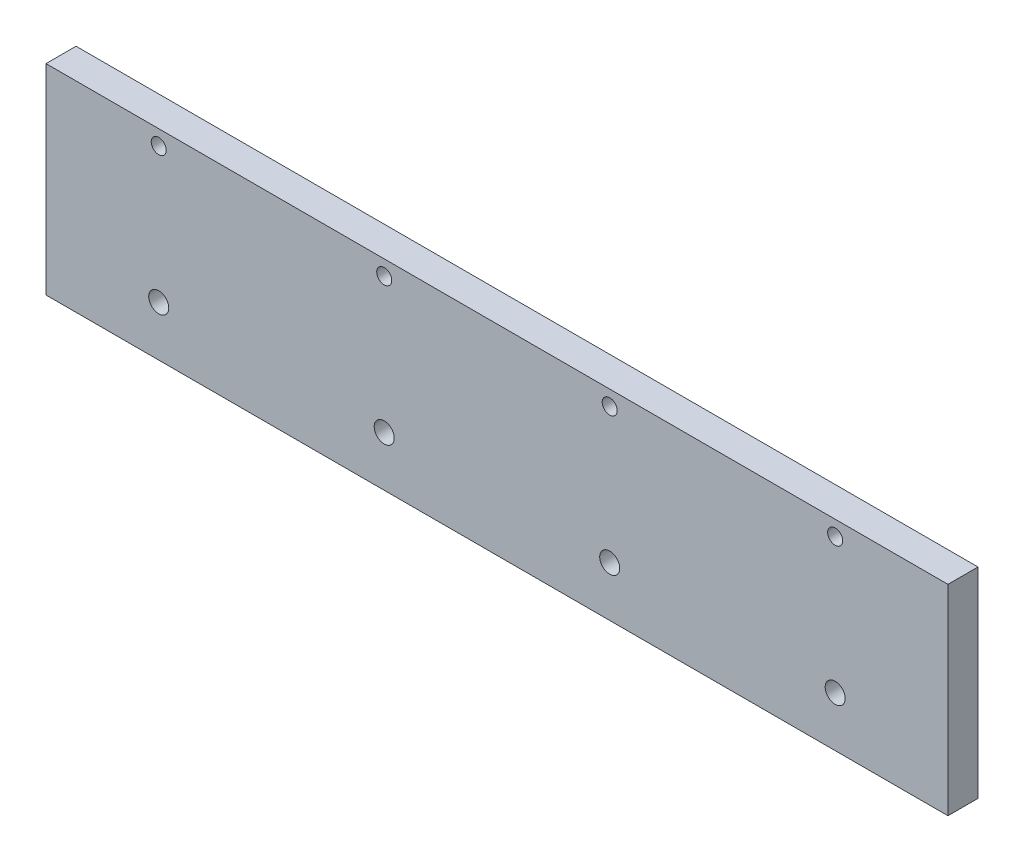
ISO-10303-21;
HEADER;
FILE_DESCRIPTION(('STEP AP214'),'2;1');
FILE_NAME('part.step','',(''),(''),'','','');
FILE_SCHEMA(('AUTOMOTIVE_DESIGN { 1 0 10303 214 1 1 1 1 }'));
ENDSEC;
DATA;
#1=APPLICATION_CONTEXT('core data for automotive mechanical design processes');
#2=APPLICATION_PROTOCOL_DEFINITION('international standard','automotive_design',2000,#1);
#3=PRODUCT_CONTEXT('',#1,'mechanical');
#4=PRODUCT('Part','Part','',(#3));
#5=PRODUCT_RELATED_PRODUCT_CATEGORY('part','',(#4));
#6=PRODUCT_DEFINITION_FORMATION('','',#4);
#7=PRODUCT_DEFINITION_CONTEXT('part definition',#1,'design');
#8=PRODUCT_DEFINITION('design','',#6,#7);
#9=PRODUCT_DEFINITION_SHAPE('','',#8);
#10=(LENGTH_UNIT() NAMED_UNIT(*) SI_UNIT(.MILLI.,.METRE.));
#11=(NAMED_UNIT(*) PLANE_ANGLE_UNIT() SI_UNIT($,.RADIAN.));
#12=(NAMED_UNIT(*) SI_UNIT($,.STERADIAN.) SOLID_ANGLE_UNIT());
#13=UNCERTAINTY_MEASURE_WITH_UNIT(LENGTH_MEASURE(1.E-05),#10,'distance_accuracy_value','');
#14=(GEOMETRIC_REPRESENTATION_CONTEXT(3) GLOBAL_UNCERTAINTY_ASSIGNED_CONTEXT((#13)) GLOBAL_UNIT_ASSIGNED_CONTEXT((#10,
#11,#12)) REPRESENTATION_CONTEXT('',''));
#15=CARTESIAN_POINT('',(0.,0.,0.));
#16=DIRECTION('',(0.,0.,1.));
#17=DIRECTION('',(1.,0.,0.));
#18=AXIS2_PLACEMENT_3D('',#15,#16,#17);
#19=CARTESIAN_POINT('',(180.,-40.,12.));
#20=DIRECTION('',(-1.,0.,0.));
#21=DIRECTION('',(0.,0.,1.));
#22=AXIS2_PLACEMENT_3D('',#19,#20,#21);
#23=PLANE('',#22);
#24=DIRECTION('',(0.,1.,0.));
#25=VECTOR('',#24,1.);
#26=CARTESIAN_POINT('',(180.,-40.,0.));
#27=LINE('',#26,#25);
#28=CARTESIAN_POINT('',(180.,-40.,0.));
#29=VERTEX_POINT('',#28);
#30=CARTESIAN_POINT('',(180.,40.,0.));
#31=VERTEX_POINT('',#30);
#32=EDGE_CURVE('E101',#29,#31,#27,.T.);
#33=ORIENTED_EDGE('',*,*,#32,.T.);
#34=DIRECTION('',(0.,0.,-1.));
#35=VECTOR('',#34,1.);
#36=CARTESIAN_POINT('',(180.,40.,12.));
#37=LINE('',#36,#35);
#38=CARTESIAN_POINT('',(180.,40.,12.));
#39=VERTEX_POINT('',#38);
#40=EDGE_CURVE('E92',#39,#31,#37,.T.);
#41=ORIENTED_EDGE('',*,*,#40,.F.);
#42=DIRECTION('',(0.,1.,0.));
#43=VECTOR('',#42,1.);
#44=CARTESIAN_POINT('',(180.,-40.,12.));
#45=LINE('',#44,#43);
#46=CARTESIAN_POINT('',(180.,-40.,12.));
#47=VERTEX_POINT('',#46);
#48=EDGE_CURVE('E86',#47,#39,#45,.T.);
#49=ORIENTED_EDGE('',*,*,#48,.F.);
#50=DIRECTION('',(0.,0.,-1.));
#51=VECTOR('',#50,1.);
#52=CARTESIAN_POINT('',(180.,-40.,12.));
#53=LINE('',#52,#51);
#54=EDGE_CURVE('E97',#47,#29,#53,.T.);
#55=ORIENTED_EDGE('',*,*,#54,.T.);
#56=EDGE_LOOP('',(#33,#41,#49,#55));
#57=FACE_BOUND('',#56,.T.);
#58=ADVANCED_FACE('F32',(#57),#23,.F.);
#59=CARTESIAN_POINT('',(-180.,40.,12.));
#60=DIRECTION('',(0.,-1.,0.));
#61=DIRECTION('',(0.,0.,-1.));
#62=AXIS2_PLACEMENT_3D('',#59,#60,#61);
#63=PLANE('',#62);
#64=DIRECTION('',(-1.,0.,0.));
#65=VECTOR('',#64,1.);
#66=CARTESIAN_POINT('',(-180.,40.,0.));
#67=LINE('',#66,#65);
#68=CARTESIAN_POINT('',(-180.,40.,0.));
#69=VERTEX_POINT('',#68);
#70=EDGE_CURVE('E91',#31,#69,#67,.T.);
#71=ORIENTED_EDGE('',*,*,#70,.T.);
#72=DIRECTION('',(0.,0.,-1.));
#73=VECTOR('',#72,1.);
#74=CARTESIAN_POINT('',(-180.,40.,12.));
#75=LINE('',#74,#73);
#76=CARTESIAN_POINT('',(-180.,40.,12.));
#77=VERTEX_POINT('',#76);
#78=EDGE_CURVE('E89',#77,#69,#75,.T.);
#79=ORIENTED_EDGE('',*,*,#78,.F.);
#80=DIRECTION('',(-1.,0.,0.));
#81=VECTOR('',#80,1.);
#82=CARTESIAN_POINT('',(-180.,40.,12.));
#83=LINE('',#82,#81);
#84=EDGE_CURVE('E80',#39,#77,#83,.T.);
#85=ORIENTED_EDGE('',*,*,#84,.F.);
#86=ORIENTED_EDGE('',*,*,#40,.T.);
#87=EDGE_LOOP('',(#71,#79,#85,#86));
#88=FACE_BOUND('',#87,.T.);
#89=ADVANCED_FACE('F90',(#88),#63,.F.);
#90=CARTESIAN_POINT('',(-180.,-40.,12.));
#91=DIRECTION('',(1.,0.,0.));
#92=DIRECTION('',(0.,0.,-1.));
#93=AXIS2_PLACEMENT_3D('',#90,#91,#92);
#94=PLANE('',#93);
#95=DIRECTION('',(0.,-1.,0.));
#96=VECTOR('',#95,1.);
#97=CARTESIAN_POINT('',(-180.,-40.,0.));
#98=LINE('',#97,#96);
#99=CARTESIAN_POINT('',(-180.,-40.,0.));
#100=VERTEX_POINT('',#99);
#101=EDGE_CURVE('E66',#69,#100,#98,.T.);
#102=ORIENTED_EDGE('',*,*,#101,.T.);
#103=DIRECTION('',(0.,0.,-1.));
#104=VECTOR('',#103,1.);
#105=CARTESIAN_POINT('',(-180.,-40.,12.));
#106=LINE('',#105,#104);
#107=CARTESIAN_POINT('',(-180.,-40.,12.));
#108=VERTEX_POINT('',#107);
#109=EDGE_CURVE('E93',#108,#100,#106,.T.);
#110=ORIENTED_EDGE('',*,*,#109,.F.);
#111=DIRECTION('',(0.,-1.,0.));
#112=VECTOR('',#111,1.);
#113=CARTESIAN_POINT('',(-180.,-40.,12.));
#114=LINE('',#113,#112);
#115=EDGE_CURVE('E84',#77,#108,#114,.T.);
#116=ORIENTED_EDGE('',*,*,#115,.F.);
#117=ORIENTED_EDGE('',*,*,#78,.T.);
#118=EDGE_LOOP('',(#102,#110,#116,#117));
#119=FACE_BOUND('',#118,.T.);
#120=ADVANCED_FACE('F95',(#119),#94,.F.);
#121=CARTESIAN_POINT('',(-180.,-40.,12.));
#122=DIRECTION('',(0.,1.,0.));
#123=DIRECTION('',(0.,0.,1.));
#124=AXIS2_PLACEMENT_3D('',#121,#122,#123);
#125=PLANE('',#124);
#126=DIRECTION('',(1.,0.,0.));
#127=VECTOR('',#126,1.);
#128=CARTESIAN_POINT('',(-180.,-40.,0.));
#129=LINE('',#128,#127);
#130=EDGE_CURVE('E72',#100,#29,#129,.T.);
#131=ORIENTED_EDGE('',*,*,#130,.T.);
#132=ORIENTED_EDGE('',*,*,#54,.F.);
#133=DIRECTION('',(1.,0.,0.));
#134=VECTOR('',#133,1.);
#135=CARTESIAN_POINT('',(-180.,-40.,12.));
#136=LINE('',#135,#134);
#137=EDGE_CURVE('E49',#108,#47,#136,.T.);
#138=ORIENTED_EDGE('',*,*,#137,.F.);
#139=ORIENTED_EDGE('',*,*,#109,.T.);
#140=EDGE_LOOP('',(#131,#132,#138,#139));
#141=FACE_BOUND('',#140,.T.);
#142=ADVANCED_FACE('F139',(#141),#125,.F.);
#143=CARTESIAN_POINT('',(180.,40.,12.));
#144=DIRECTION('',(0.,0.,-1.));
#145=DIRECTION('',(-1.,0.,0.));
#146=AXIS2_PLACEMENT_3D('',#143,#144,#145);
#147=PLANE('',#146);
#148=CARTESIAN_POINT('',(-45.,34.,12.));
#149=DIRECTION('',(0.,0.,1.));
#150=DIRECTION('',(1.,0.,0.));
#151=AXIS2_PLACEMENT_3D('',#148,#149,#150);
#152=CIRCLE('',#151,2.99999999999999);
#153=CARTESIAN_POINT('',(-42.,34.,12.));
#154=VERTEX_POINT('',#153);
#155=EDGE_CURVE('E220',#154,#154,#152,.T.);
#156=ORIENTED_EDGE('',*,*,#155,.F.);
#157=EDGE_LOOP('',(#156));
#158=FACE_BOUND('',#157,.T.);
#159=CARTESIAN_POINT('',(-45.,-20.,12.));
#160=DIRECTION('',(0.,0.,1.));
#161=DIRECTION('',(1.,0.,0.));
#162=AXIS2_PLACEMENT_3D('',#159,#160,#161);
#163=CIRCLE('',#162,3.99999999999999);
#164=CARTESIAN_POINT('',(-41.,-20.,12.));
#165=VERTEX_POINT('',#164);
#166=EDGE_CURVE('E212',#165,#165,#163,.T.);
#167=ORIENTED_EDGE('',*,*,#166,.F.);
#168=EDGE_LOOP('',(#167));
#169=FACE_BOUND('',#168,.T.);
#170=CARTESIAN_POINT('',(-135.,-20.,12.));
#171=DIRECTION('',(0.,0.,1.));
#172=DIRECTION('',(1.,0.,0.));
#173=AXIS2_PLACEMENT_3D('',#170,#171,#172);
#174=CIRCLE('',#173,3.99999999999999);
#175=CARTESIAN_POINT('',(-131.,-20.,12.));
#176=VERTEX_POINT('',#175);
#177=EDGE_CURVE('E206',#176,#176,#174,.T.);
#178=ORIENTED_EDGE('',*,*,#177,.F.);
#179=EDGE_LOOP('',(#178));
#180=FACE_BOUND('',#179,.T.);
#181=CARTESIAN_POINT('',(-135.,34.,12.));
#182=DIRECTION('',(0.,0.,1.));
#183=DIRECTION('',(1.,0.,0.));
#184=AXIS2_PLACEMENT_3D('',#181,#182,#183);
#185=CIRCLE('',#184,2.99999999999999);
#186=CARTESIAN_POINT('',(-132.,34.,12.));
#187=VERTEX_POINT('',#186);
#188=EDGE_CURVE('E104',#187,#187,#185,.T.);
#189=ORIENTED_EDGE('',*,*,#188,.F.);
#190=EDGE_LOOP('',(#189));
#191=FACE_BOUND('',#190,.T.);
#192=ORIENTED_EDGE('',*,*,#48,.T.);
#193=ORIENTED_EDGE('',*,*,#84,.T.);
#194=ORIENTED_EDGE('',*,*,#115,.T.);
#195=ORIENTED_EDGE('',*,*,#137,.T.);
#196=EDGE_LOOP('',(#192,#193,#194,#195));
#197=FACE_BOUND('',#196,.T.);
#198=CARTESIAN_POINT('',(45.,-20.,12.));
#199=DIRECTION('',(0.,0.,1.));
#200=DIRECTION('',(1.,0.,0.));
#201=AXIS2_PLACEMENT_3D('',#198,#199,#200);
#202=CIRCLE('',#201,3.99999999999999);
#203=CARTESIAN_POINT('',(49.,-20.,12.));
#204=VERTEX_POINT('',#203);
#205=EDGE_CURVE('E114',#204,#204,#202,.T.);
#206=ORIENTED_EDGE('',*,*,#205,.F.);
#207=EDGE_LOOP('',(#206));
#208=FACE_BOUND('',#207,.T.);
#209=CARTESIAN_POINT('',(135.,-20.,12.));
#210=DIRECTION('',(0.,0.,1.));
#211=DIRECTION('',(1.,0.,0.));
#212=AXIS2_PLACEMENT_3D('',#209,#210,#211);
#213=CIRCLE('',#212,3.99999999999999);
#214=CARTESIAN_POINT('',(139.,-20.,12.));
#215=VERTEX_POINT('',#214);
#216=EDGE_CURVE('E120',#215,#215,#213,.T.);
#217=ORIENTED_EDGE('',*,*,#216,.F.);
#218=EDGE_LOOP('',(#217));
#219=FACE_BOUND('',#218,.T.);
#220=CARTESIAN_POINT('',(45.,34.,12.));
#221=DIRECTION('',(0.,0.,1.));
#222=DIRECTION('',(1.,0.,0.));
#223=AXIS2_PLACEMENT_3D('',#220,#221,#222);
#224=CIRCLE('',#223,2.99999999999999);
#225=CARTESIAN_POINT('',(48.,34.,12.));
#226=VERTEX_POINT('',#225);
#227=EDGE_CURVE('E126',#226,#226,#224,.T.);
#228=ORIENTED_EDGE('',*,*,#227,.F.);
#229=EDGE_LOOP('',(#228));
#230=FACE_BOUND('',#229,.T.);
#231=CARTESIAN_POINT('',(135.,34.,12.));
#232=DIRECTION('',(0.,0.,1.));
#233=DIRECTION('',(1.,0.,0.));
#234=AXIS2_PLACEMENT_3D('',#231,#232,#233);
#235=CIRCLE('',#234,2.99999999999999);
#236=CARTESIAN_POINT('',(138.,34.,12.));
#237=VERTEX_POINT('',#236);
#238=EDGE_CURVE('E11',#237,#237,#235,.T.);
#239=ORIENTED_EDGE('',*,*,#238,.F.);
#240=EDGE_LOOP('',(#239));
#241=FACE_BOUND('',#240,.T.);
#242=ADVANCED_FACE('F81',(#158,#169,#180,#191,#197,#208,#219,#230,#241),#147,.F.);
#243=CARTESIAN_POINT('',(180.,40.,0.));
#244=DIRECTION('',(0.,0.,-1.));
#245=DIRECTION('',(-1.,0.,0.));
#246=AXIS2_PLACEMENT_3D('',#243,#244,#245);
#247=PLANE('',#246);
#248=CARTESIAN_POINT('',(-45.,34.,0.));
#249=DIRECTION('',(0.,0.,-1.));
#250=DIRECTION('',(-1.,0.,0.));
#251=AXIS2_PLACEMENT_3D('',#248,#249,#250);
#252=CIRCLE('',#251,2.99999999999999);
#253=CARTESIAN_POINT('',(-48.,34.,0.));
#254=VERTEX_POINT('',#253);
#255=EDGE_CURVE('E223',#254,#254,#252,.F.);
#256=ORIENTED_EDGE('',*,*,#255,.T.);
#257=EDGE_LOOP('',(#256));
#258=FACE_BOUND('',#257,.T.);
#259=CARTESIAN_POINT('',(-45.,-20.,0.));
#260=DIRECTION('',(0.,0.,-1.));
#261=DIRECTION('',(-1.,0.,0.));
#262=AXIS2_PLACEMENT_3D('',#259,#260,#261);
#263=CIRCLE('',#262,3.99999999999999);
#264=CARTESIAN_POINT('',(-49.,-20.,0.));
#265=VERTEX_POINT('',#264);
#266=EDGE_CURVE('E217',#265,#265,#263,.F.);
#267=ORIENTED_EDGE('',*,*,#266,.T.);
#268=EDGE_LOOP('',(#267));
#269=FACE_BOUND('',#268,.T.);
#270=CARTESIAN_POINT('',(-135.,-20.,0.));
#271=DIRECTION('',(0.,0.,-1.));
#272=DIRECTION('',(-1.,0.,0.));
#273=AXIS2_PLACEMENT_3D('',#270,#271,#272);
#274=CIRCLE('',#273,3.99999999999999);
#275=CARTESIAN_POINT('',(-139.,-20.,0.));
#276=VERTEX_POINT('',#275);
#277=EDGE_CURVE('E209',#276,#276,#274,.F.);
#278=ORIENTED_EDGE('',*,*,#277,.T.);
#279=EDGE_LOOP('',(#278));
#280=FACE_BOUND('',#279,.T.);
#281=CARTESIAN_POINT('',(-135.,34.,0.));
#282=DIRECTION('',(0.,0.,-1.));
#283=DIRECTION('',(-1.,0.,0.));
#284=AXIS2_PLACEMENT_3D('',#281,#282,#283);
#285=CIRCLE('',#284,2.99999999999999);
#286=CARTESIAN_POINT('',(-138.,34.,0.));
#287=VERTEX_POINT('',#286);
#288=EDGE_CURVE('E201',#287,#287,#285,.F.);
#289=ORIENTED_EDGE('',*,*,#288,.T.);
#290=EDGE_LOOP('',(#289));
#291=FACE_BOUND('',#290,.T.);
#292=ORIENTED_EDGE('',*,*,#32,.F.);
#293=ORIENTED_EDGE('',*,*,#130,.F.);
#294=ORIENTED_EDGE('',*,*,#101,.F.);
#295=ORIENTED_EDGE('',*,*,#70,.F.);
#296=EDGE_LOOP('',(#292,#293,#294,#295));
#297=FACE_BOUND('',#296,.T.);
#298=CARTESIAN_POINT('',(45.,-20.,0.));
#299=DIRECTION('',(0.,0.,-1.));
#300=DIRECTION('',(-1.,0.,0.));
#301=AXIS2_PLACEMENT_3D('',#298,#299,#300);
#302=CIRCLE('',#301,3.99999999999999);
#303=CARTESIAN_POINT('',(41.,-20.,0.));
#304=VERTEX_POINT('',#303);
#305=EDGE_CURVE('E111',#304,#304,#302,.F.);
#306=ORIENTED_EDGE('',*,*,#305,.T.);
#307=EDGE_LOOP('',(#306));
#308=FACE_BOUND('',#307,.T.);
#309=CARTESIAN_POINT('',(135.,-20.,0.));
#310=DIRECTION('',(0.,0.,-1.));
#311=DIRECTION('',(-1.,0.,0.));
#312=AXIS2_PLACEMENT_3D('',#309,#310,#311);
#313=CIRCLE('',#312,3.99999999999999);
#314=CARTESIAN_POINT('',(131.,-20.,0.));
#315=VERTEX_POINT('',#314);
#316=EDGE_CURVE('E117',#315,#315,#313,.F.);
#317=ORIENTED_EDGE('',*,*,#316,.T.);
#318=EDGE_LOOP('',(#317));
#319=FACE_BOUND('',#318,.T.);
#320=CARTESIAN_POINT('',(45.,34.,0.));
#321=DIRECTION('',(0.,0.,-1.));
#322=DIRECTION('',(-1.,0.,0.));
#323=AXIS2_PLACEMENT_3D('',#320,#321,#322);
#324=CIRCLE('',#323,2.99999999999999);
#325=CARTESIAN_POINT('',(42.,34.,0.));
#326=VERTEX_POINT('',#325);
#327=EDGE_CURVE('E123',#326,#326,#324,.F.);
#328=ORIENTED_EDGE('',*,*,#327,.T.);
#329=EDGE_LOOP('',(#328));
#330=FACE_BOUND('',#329,.T.);
#331=CARTESIAN_POINT('',(135.,34.,0.));
#332=DIRECTION('',(0.,0.,-1.));
#333=DIRECTION('',(-1.,0.,0.));
#334=AXIS2_PLACEMENT_3D('',#331,#332,#333);
#335=CIRCLE('',#334,2.99999999999999);
#336=CARTESIAN_POINT('',(132.,34.,0.));
#337=VERTEX_POINT('',#336);
#338=EDGE_CURVE('E41',#337,#337,#335,.F.);
#339=ORIENTED_EDGE('',*,*,#338,.T.);
#340=EDGE_LOOP('',(#339));
#341=FACE_BOUND('',#340,.T.);
#342=ADVANCED_FACE('F131',(#258,#269,#280,#291,#297,#308,#319,#330,#341),#247,.T.);
#343=CARTESIAN_POINT('',(-135.,34.,-0.000999999999999265));
#344=DIRECTION('',(0.,0.,1.));
#345=DIRECTION('',(1.,0.,0.));
#346=AXIS2_PLACEMENT_3D('',#343,#344,#345);
#347=CYLINDRICAL_SURFACE('',#346,2.99999999999999);
#348=ORIENTED_EDGE('',*,*,#288,.F.);
#349=EDGE_LOOP('',(#348));
#350=FACE_BOUND('',#349,.T.);
#351=ORIENTED_EDGE('',*,*,#188,.T.);
#352=EDGE_LOOP('',(#351));
#353=FACE_BOUND('',#352,.T.);
#354=ADVANCED_FACE('F146',(#350,#353),#347,.F.);
#355=CARTESIAN_POINT('',(-135.,-20.,-0.000999999999999265));
#356=DIRECTION('',(0.,0.,1.));
#357=DIRECTION('',(1.,0.,0.));
#358=AXIS2_PLACEMENT_3D('',#355,#356,#357);
#359=CYLINDRICAL_SURFACE('',#358,3.99999999999999);
#360=ORIENTED_EDGE('',*,*,#277,.F.);
#361=EDGE_LOOP('',(#360));
#362=FACE_BOUND('',#361,.T.);
#363=ORIENTED_EDGE('',*,*,#177,.T.);
#364=EDGE_LOOP('',(#363));
#365=FACE_BOUND('',#364,.T.);
#366=ADVANCED_FACE('F190',(#362,#365),#359,.F.);
#367=CARTESIAN_POINT('',(-45.,-20.,-0.000999999999999265));
#368=DIRECTION('',(0.,0.,1.));
#369=DIRECTION('',(1.,0.,0.));
#370=AXIS2_PLACEMENT_3D('',#367,#368,#369);
#371=CYLINDRICAL_SURFACE('',#370,3.99999999999999);
#372=ORIENTED_EDGE('',*,*,#266,.F.);
#373=EDGE_LOOP('',(#372));
#374=FACE_BOUND('',#373,.T.);
#375=ORIENTED_EDGE('',*,*,#166,.T.);
#376=EDGE_LOOP('',(#375));
#377=FACE_BOUND('',#376,.T.);
#378=ADVANCED_FACE('F166',(#374,#377),#371,.F.);
#379=CARTESIAN_POINT('',(45.,-20.,-0.000999999999999265));
#380=DIRECTION('',(0.,0.,1.));
#381=DIRECTION('',(1.,0.,0.));
#382=AXIS2_PLACEMENT_3D('',#379,#380,#381);
#383=CYLINDRICAL_SURFACE('',#382,3.99999999999999);
#384=ORIENTED_EDGE('',*,*,#305,.F.);
#385=EDGE_LOOP('',(#384));
#386=FACE_BOUND('',#385,.T.);
#387=ORIENTED_EDGE('',*,*,#205,.T.);
#388=EDGE_LOOP('',(#387));
#389=FACE_BOUND('',#388,.T.);
#390=ADVANCED_FACE('F162',(#386,#389),#383,.F.);
#391=CARTESIAN_POINT('',(135.,-20.,-0.000999999999999265));
#392=DIRECTION('',(0.,0.,1.));
#393=DIRECTION('',(1.,0.,0.));
#394=AXIS2_PLACEMENT_3D('',#391,#392,#393);
#395=CYLINDRICAL_SURFACE('',#394,3.99999999999999);
#396=ORIENTED_EDGE('',*,*,#316,.F.);
#397=EDGE_LOOP('',(#396));
#398=FACE_BOUND('',#397,.T.);
#399=ORIENTED_EDGE('',*,*,#216,.T.);
#400=EDGE_LOOP('',(#399));
#401=FACE_BOUND('',#400,.T.);
#402=ADVANCED_FACE('F165',(#398,#401),#395,.F.);
#403=CARTESIAN_POINT('',(-45.,34.,-0.000999999999999265));
#404=DIRECTION('',(0.,0.,1.));
#405=DIRECTION('',(1.,0.,0.));
#406=AXIS2_PLACEMENT_3D('',#403,#404,#405);
#407=CYLINDRICAL_SURFACE('',#406,2.99999999999999);
#408=ORIENTED_EDGE('',*,*,#255,.F.);
#409=EDGE_LOOP('',(#408));
#410=FACE_BOUND('',#409,.T.);
#411=ORIENTED_EDGE('',*,*,#155,.T.);
#412=EDGE_LOOP('',(#411));
#413=FACE_BOUND('',#412,.T.);
#414=ADVANCED_FACE('F169',(#410,#413),#407,.F.);
#415=CARTESIAN_POINT('',(45.,34.,-0.000999999999999265));
#416=DIRECTION('',(0.,0.,1.));
#417=DIRECTION('',(1.,0.,0.));
#418=AXIS2_PLACEMENT_3D('',#415,#416,#417);
#419=CYLINDRICAL_SURFACE('',#418,2.99999999999999);
#420=ORIENTED_EDGE('',*,*,#327,.F.);
#421=EDGE_LOOP('',(#420));
#422=FACE_BOUND('',#421,.T.);
#423=ORIENTED_EDGE('',*,*,#227,.T.);
#424=EDGE_LOOP('',(#423));
#425=FACE_BOUND('',#424,.T.);
#426=ADVANCED_FACE('F135',(#422,#425),#419,.F.);
#427=CARTESIAN_POINT('',(135.,34.,-0.000999999999999265));
#428=DIRECTION('',(0.,0.,1.));
#429=DIRECTION('',(1.,0.,0.));
#430=AXIS2_PLACEMENT_3D('',#427,#428,#429);
#431=CYLINDRICAL_SURFACE('',#430,2.99999999999999);
#432=ORIENTED_EDGE('',*,*,#338,.F.);
#433=EDGE_LOOP('',(#432));
#434=FACE_BOUND('',#433,.T.);
#435=ORIENTED_EDGE('',*,*,#238,.T.);
#436=EDGE_LOOP('',(#435));
#437=FACE_BOUND('',#436,.T.);
#438=ADVANCED_FACE('F34',(#434,#437),#431,.F.);
#439=CLOSED_SHELL('',(#58,#89,#120,#142,#242,#342,#354,#366,#378,#390,#402,#414,#426,#438));
#440=MANIFOLD_SOLID_BREP('B2',#439);
#441=ADVANCED_BREP_SHAPE_REPRESENTATION('',(#18,#440),#14);
#442=SHAPE_DEFINITION_REPRESENTATION(#9,#441);
ENDSEC;
END-ISO-10303-21;
